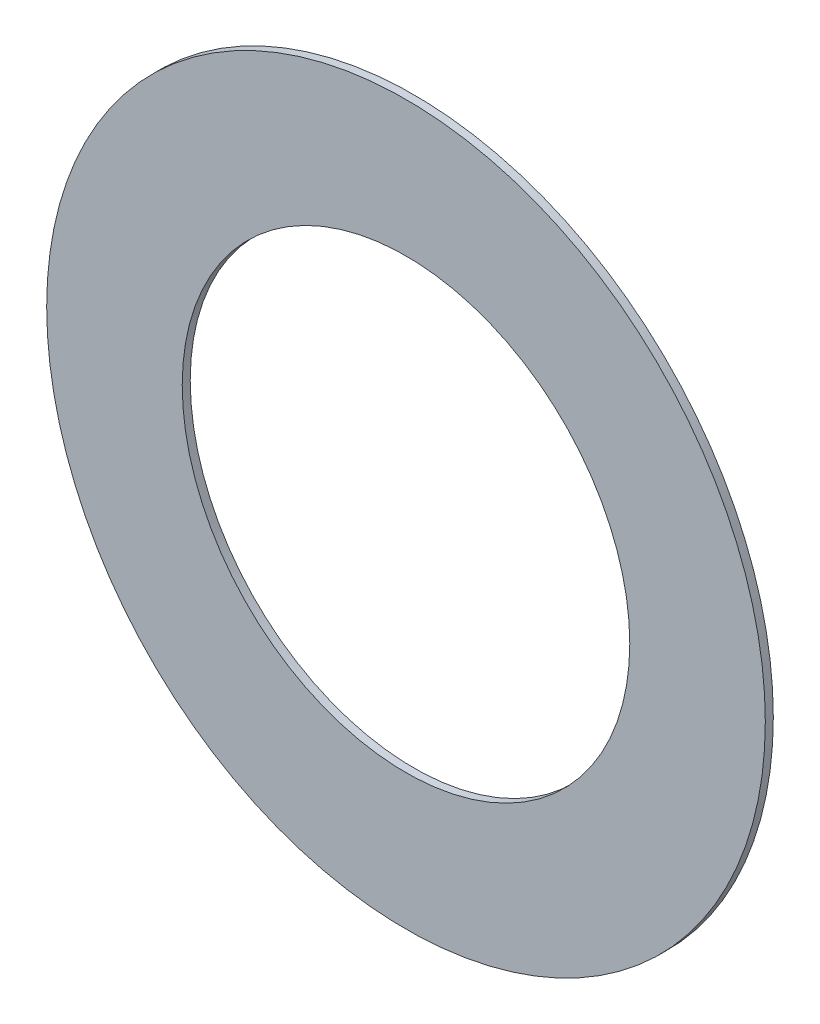
ISO-10303-21;
HEADER;
FILE_DESCRIPTION(('STEP AP214'),'2;1');
FILE_NAME('part.step','',(''),(''),'','','');
FILE_SCHEMA(('AUTOMOTIVE_DESIGN { 1 0 10303 214 1 1 1 1 }'));
ENDSEC;
DATA;
#1=APPLICATION_CONTEXT('core data for automotive mechanical design processes');
#2=APPLICATION_PROTOCOL_DEFINITION('international standard','automotive_design',2000,#1);
#3=PRODUCT_CONTEXT('',#1,'mechanical');
#4=PRODUCT('Part','Part','',(#3));
#5=PRODUCT_RELATED_PRODUCT_CATEGORY('part','',(#4));
#6=PRODUCT_DEFINITION_FORMATION('','',#4);
#7=PRODUCT_DEFINITION_CONTEXT('part definition',#1,'design');
#8=PRODUCT_DEFINITION('design','',#6,#7);
#9=PRODUCT_DEFINITION_SHAPE('','',#8);
#10=(LENGTH_UNIT() NAMED_UNIT(*) SI_UNIT(.MILLI.,.METRE.));
#11=(NAMED_UNIT(*) PLANE_ANGLE_UNIT() SI_UNIT($,.RADIAN.));
#12=(NAMED_UNIT(*) SI_UNIT($,.STERADIAN.) SOLID_ANGLE_UNIT());
#13=UNCERTAINTY_MEASURE_WITH_UNIT(LENGTH_MEASURE(1.E-05),#10,'distance_accuracy_value','');
#14=(GEOMETRIC_REPRESENTATION_CONTEXT(3) GLOBAL_UNCERTAINTY_ASSIGNED_CONTEXT((#13)) GLOBAL_UNIT_ASSIGNED_CONTEXT((#10,
#11,#12)) REPRESENTATION_CONTEXT('',''));
#15=CARTESIAN_POINT('',(0.,0.,0.));
#16=DIRECTION('',(0.,0.,1.));
#17=DIRECTION('',(1.,0.,0.));
#18=AXIS2_PLACEMENT_3D('',#15,#16,#17);
#19=CARTESIAN_POINT('',(0.,0.,0.0127));
#20=DIRECTION('',(0.,0.,1.));
#21=DIRECTION('',(1.,0.,0.));
#22=AXIS2_PLACEMENT_3D('',#19,#20,#21);
#23=PLANE('',#22);
#24=CARTESIAN_POINT('',(24.0000028,-2.5000204,0.0127));
#25=DIRECTION('',(0.,0.,1.));
#26=DIRECTION('',(1.,0.,0.));
#27=AXIS2_PLACEMENT_3D('',#24,#25,#26);
#28=CIRCLE('',#27,0.3549904);
#29=CARTESIAN_POINT('',(24.3549932,-2.5000204,0.0127));
#30=VERTEX_POINT('',#29);
#31=EDGE_CURVE('E27',#30,#30,#28,.F.);
#32=ORIENTED_EDGE('',*,*,#31,.T.);
#33=EDGE_LOOP('',(#32));
#34=FACE_BOUND('',#33,.T.);
#35=CARTESIAN_POINT('',(24.0000028,-2.5000204,0.0127));
#36=DIRECTION('',(0.,0.,1.));
#37=DIRECTION('',(1.,0.,0.));
#38=AXIS2_PLACEMENT_3D('',#35,#36,#37);
#39=CIRCLE('',#38,0.5700014);
#40=CARTESIAN_POINT('',(24.5700042,-2.5000204,0.0127));
#41=VERTEX_POINT('',#40);
#42=EDGE_CURVE('E18',#41,#41,#39,.F.);
#43=ORIENTED_EDGE('',*,*,#42,.F.);
#44=EDGE_LOOP('',(#43));
#45=FACE_BOUND('',#44,.T.);
#46=ADVANCED_FACE('F15',(#34,#45),#23,.T.);
#47=CARTESIAN_POINT('',(24.0000028,-2.5000204,0.));
#48=DIRECTION('',(0.,0.,1.));
#49=DIRECTION('',(1.,0.,0.));
#50=AXIS2_PLACEMENT_3D('',#47,#48,#49);
#51=CYLINDRICAL_SURFACE('',#50,0.5700014);
#52=ORIENTED_EDGE('',*,*,#42,.T.);
#53=EDGE_LOOP('',(#52));
#54=FACE_BOUND('',#53,.T.);
#55=CARTESIAN_POINT('',(24.0000028,-2.5000204,0.));
#56=DIRECTION('',(0.,0.,1.));
#57=DIRECTION('',(1.,0.,0.));
#58=AXIS2_PLACEMENT_3D('',#55,#56,#57);
#59=CIRCLE('',#58,0.5700014);
#60=CARTESIAN_POINT('',(24.5700042,-2.5000204,0.));
#61=VERTEX_POINT('',#60);
#62=EDGE_CURVE('E22',#61,#61,#59,.T.);
#63=ORIENTED_EDGE('',*,*,#62,.T.);
#64=EDGE_LOOP('',(#63));
#65=FACE_BOUND('',#64,.T.);
#66=ADVANCED_FACE('F35',(#54,#65),#51,.T.);
#67=CARTESIAN_POINT('',(24.0000028,-2.5000204,0.));
#68=DIRECTION('',(0.,0.,1.));
#69=DIRECTION('',(1.,0.,0.));
#70=AXIS2_PLACEMENT_3D('',#67,#68,#69);
#71=CYLINDRICAL_SURFACE('',#70,0.3549904);
#72=ORIENTED_EDGE('',*,*,#31,.F.);
#73=EDGE_LOOP('',(#72));
#74=FACE_BOUND('',#73,.T.);
#75=CARTESIAN_POINT('',(24.0000028,-2.5000204,0.));
#76=DIRECTION('',(0.,0.,1.));
#77=DIRECTION('',(1.,0.,0.));
#78=AXIS2_PLACEMENT_3D('',#75,#76,#77);
#79=CIRCLE('',#78,0.3549904);
#80=CARTESIAN_POINT('',(24.3549932,-2.5000204,0.));
#81=VERTEX_POINT('',#80);
#82=EDGE_CURVE('E10',#81,#81,#79,.F.);
#83=ORIENTED_EDGE('',*,*,#82,.T.);
#84=EDGE_LOOP('',(#83));
#85=FACE_BOUND('',#84,.T.);
#86=ADVANCED_FACE('F43',(#74,#85),#71,.F.);
#87=CARTESIAN_POINT('',(0.,0.,0.));
#88=DIRECTION('',(0.,0.,1.));
#89=DIRECTION('',(1.,0.,0.));
#90=AXIS2_PLACEMENT_3D('',#87,#88,#89);
#91=PLANE('',#90);
#92=ORIENTED_EDGE('',*,*,#82,.F.);
#93=EDGE_LOOP('',(#92));
#94=FACE_BOUND('',#93,.T.);
#95=ORIENTED_EDGE('',*,*,#62,.F.);
#96=EDGE_LOOP('',(#95));
#97=FACE_BOUND('',#96,.T.);
#98=ADVANCED_FACE('F44',(#94,#97),#91,.F.);
#99=CLOSED_SHELL('',(#46,#66,#86,#98));
#100=MANIFOLD_SOLID_BREP('B1',#99);
#101=ADVANCED_BREP_SHAPE_REPRESENTATION('',(#18,#100),#14);
#102=SHAPE_DEFINITION_REPRESENTATION(#9,#101);
ENDSEC;
END-ISO-10303-21;
